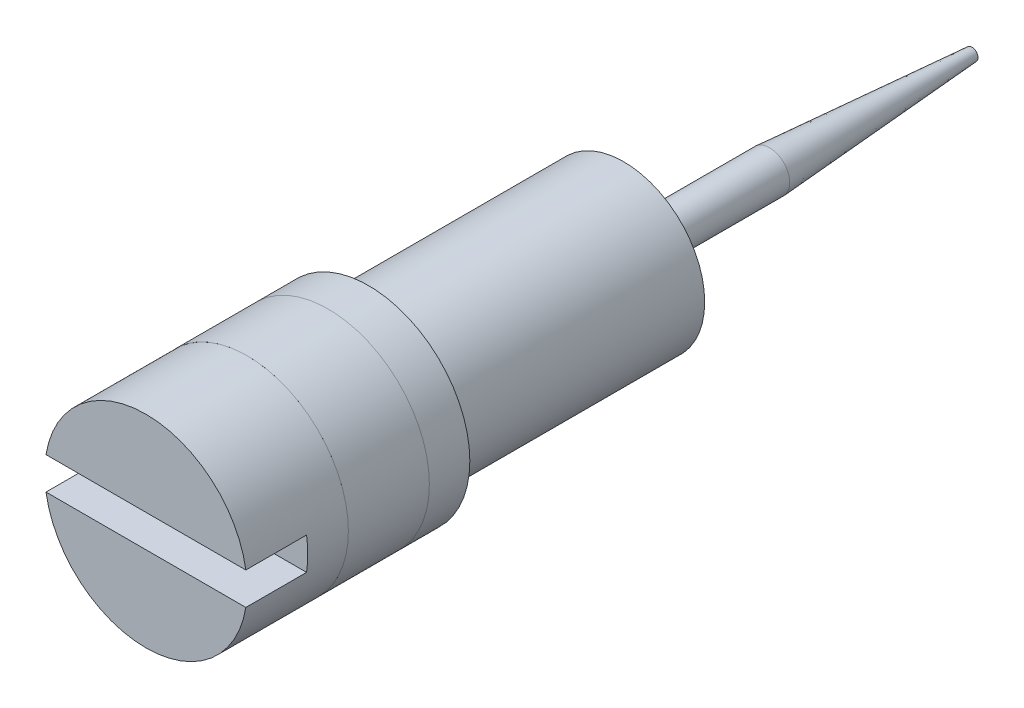
ISO-10303-21;
HEADER;
FILE_DESCRIPTION(('STEP AP214'),'2;1');
FILE_NAME('part.step','',(''),(''),'','','');
FILE_SCHEMA(('AUTOMOTIVE_DESIGN { 1 0 10303 214 1 1 1 1 }'));
ENDSEC;
DATA;
#1=APPLICATION_CONTEXT('core data for automotive mechanical design processes');
#2=APPLICATION_PROTOCOL_DEFINITION('international standard','automotive_design',2000,#1);
#3=PRODUCT_CONTEXT('',#1,'mechanical');
#4=PRODUCT('Part','Part','',(#3));
#5=PRODUCT_RELATED_PRODUCT_CATEGORY('part','',(#4));
#6=PRODUCT_DEFINITION_FORMATION('','',#4);
#7=PRODUCT_DEFINITION_CONTEXT('part definition',#1,'design');
#8=PRODUCT_DEFINITION('design','',#6,#7);
#9=PRODUCT_DEFINITION_SHAPE('','',#8);
#10=(LENGTH_UNIT() NAMED_UNIT(*) SI_UNIT(.MILLI.,.METRE.));
#11=(NAMED_UNIT(*) PLANE_ANGLE_UNIT() SI_UNIT($,.RADIAN.));
#12=(NAMED_UNIT(*) SI_UNIT($,.STERADIAN.) SOLID_ANGLE_UNIT());
#13=UNCERTAINTY_MEASURE_WITH_UNIT(LENGTH_MEASURE(1.E-05),#10,'distance_accuracy_value','');
#14=(GEOMETRIC_REPRESENTATION_CONTEXT(3) GLOBAL_UNCERTAINTY_ASSIGNED_CONTEXT((#13)) GLOBAL_UNIT_ASSIGNED_CONTEXT((#10,
#11,#12)) REPRESENTATION_CONTEXT('',''));
#15=CARTESIAN_POINT('',(0.,0.,0.));
#16=DIRECTION('',(0.,0.,1.));
#17=DIRECTION('',(1.,0.,0.));
#18=AXIS2_PLACEMENT_3D('',#15,#16,#17);
#19=CARTESIAN_POINT('',(0.,0.,4.04363136286653));
#20=DIRECTION('',(0.,0.,0.999999999999998));
#21=DIRECTION('',(0.999999999999998,0.,0.));
#22=AXIS2_PLACEMENT_3D('',#19,#20,#21);
#23=CYLINDRICAL_SURFACE('',#22,1.65);
#24=CARTESIAN_POINT('',(0.,0.,-1.99999999999995));
#25=DIRECTION('',(0.,0.,0.999999999999998));
#26=DIRECTION('',(0.999999999999998,0.,0.));
#27=AXIS2_PLACEMENT_3D('',#24,#25,#26);
#28=CIRCLE('',#27,1.65);
#29=CARTESIAN_POINT('',(1.64999999999999,0.,-1.99999999999995));
#30=VERTEX_POINT('',#29);
#31=EDGE_CURVE('E11',#30,#30,#28,.T.);
#32=CARTESIAN_POINT('',(0.,0.,0.));
#33=DIRECTION('',(0.,0.,0.999999999999998));
#34=DIRECTION('',(0.999999999999998,0.,0.));
#35=AXIS2_PLACEMENT_3D('',#32,#33,#34);
#36=CIRCLE('',#35,1.65);
#37=CARTESIAN_POINT('',(1.64999999999999,0.,0.));
#38=VERTEX_POINT('',#37);
#39=EDGE_CURVE('E60',#38,#38,#36,.T.);
#40=CARTESIAN_POINT('',(1.64999999999999,0.,-1.99999999999995));
#41=CARTESIAN_POINT('',(1.64999999999999,0.,-1.97916666666662));
#42=CARTESIAN_POINT('',(1.64999999999999,0.,-1.95833333333328));
#43=CARTESIAN_POINT('',(1.64999999999999,0.,-1.91666666666662));
#44=CARTESIAN_POINT('',(1.64999999999999,0.,-1.89583333333328));
#45=CARTESIAN_POINT('',(1.64999999999999,0.,-1.85416666666662));
#46=CARTESIAN_POINT('',(1.64999999999999,0.,-1.83333333333329));
#47=CARTESIAN_POINT('',(1.64999999999999,0.,-1.79166666666662));
#48=CARTESIAN_POINT('',(1.64999999999999,0.,-1.77083333333329));
#49=CARTESIAN_POINT('',(1.64999999999999,0.,-1.72916666666662));
#50=CARTESIAN_POINT('',(1.64999999999999,0.,-1.70833333333329));
#51=CARTESIAN_POINT('',(1.64999999999999,0.,-1.66666666666662));
#52=CARTESIAN_POINT('',(1.64999999999999,0.,-1.64583333333329));
#53=CARTESIAN_POINT('',(1.64999999999999,0.,-1.60416666666662));
#54=CARTESIAN_POINT('',(1.64999999999999,0.,-1.58333333333329));
#55=CARTESIAN_POINT('',(1.64999999999999,0.,-1.54166666666663));
#56=CARTESIAN_POINT('',(1.64999999999999,0.,-1.52083333333329));
#57=CARTESIAN_POINT('',(1.64999999999999,0.,-1.47916666666663));
#58=CARTESIAN_POINT('',(1.64999999999999,0.,-1.4583333333333));
#59=CARTESIAN_POINT('',(1.64999999999999,0.,-1.41666666666663));
#60=CARTESIAN_POINT('',(1.64999999999999,0.,-1.3958333333333));
#61=CARTESIAN_POINT('',(1.64999999999999,0.,-1.35416666666663));
#62=CARTESIAN_POINT('',(1.64999999999999,0.,-1.3333333333333));
#63=CARTESIAN_POINT('',(1.64999999999999,0.,-1.29166666666663));
#64=CARTESIAN_POINT('',(1.64999999999999,0.,-1.2708333333333));
#65=CARTESIAN_POINT('',(1.64999999999999,0.,-1.22916666666663));
#66=CARTESIAN_POINT('',(1.64999999999999,0.,-1.2083333333333));
#67=CARTESIAN_POINT('',(1.64999999999999,0.,-1.16666666666664));
#68=CARTESIAN_POINT('',(1.64999999999999,0.,-1.1458333333333));
#69=CARTESIAN_POINT('',(1.64999999999999,0.,-1.10416666666664));
#70=CARTESIAN_POINT('',(1.64999999999999,0.,-1.08333333333331));
#71=CARTESIAN_POINT('',(1.64999999999999,0.,-1.04166666666664));
#72=CARTESIAN_POINT('',(1.64999999999999,0.,-1.02083333333331));
#73=CARTESIAN_POINT('',(1.64999999999999,0.,-0.979166666666642));
#74=CARTESIAN_POINT('',(1.64999999999999,0.,-0.958333333333309));
#75=CARTESIAN_POINT('',(1.64999999999999,0.,-0.916666666666644));
#76=CARTESIAN_POINT('',(1.64999999999999,0.,-0.895833333333311));
#77=CARTESIAN_POINT('',(1.64999999999999,0.,-0.854166666666645));
#78=CARTESIAN_POINT('',(1.64999999999999,0.,-0.833333333333313));
#79=CARTESIAN_POINT('',(1.64999999999999,0.,-0.791666666666647));
#80=CARTESIAN_POINT('',(1.64999999999999,0.,-0.770833333333314));
#81=CARTESIAN_POINT('',(1.64999999999999,0.,-0.729166666666649));
#82=CARTESIAN_POINT('',(1.64999999999999,0.,-0.708333333333316));
#83=CARTESIAN_POINT('',(1.64999999999999,0.,-0.66666666666665));
#84=CARTESIAN_POINT('',(1.64999999999999,0.,-0.645833333333317));
#85=CARTESIAN_POINT('',(1.64999999999999,0.,-0.604166666666652));
#86=CARTESIAN_POINT('',(1.64999999999999,0.,-0.583333333333319));
#87=CARTESIAN_POINT('',(1.64999999999999,0.,-0.541666666666654));
#88=CARTESIAN_POINT('',(1.64999999999999,0.,-0.520833333333321));
#89=CARTESIAN_POINT('',(1.64999999999999,0.,-0.479166666666656));
#90=CARTESIAN_POINT('',(1.64999999999999,0.,-0.458333333333323));
#91=CARTESIAN_POINT('',(1.64999999999999,0.,-0.416666666666657));
#92=CARTESIAN_POINT('',(1.64999999999999,0.,-0.395833333333324));
#93=CARTESIAN_POINT('',(1.64999999999999,0.,-0.354166666666659));
#94=CARTESIAN_POINT('',(1.64999999999999,0.,-0.333333333333326));
#95=CARTESIAN_POINT('',(1.64999999999999,0.,-0.29166666666666));
#96=CARTESIAN_POINT('',(1.64999999999999,0.,-0.270833333333327));
#97=CARTESIAN_POINT('',(1.64999999999999,0.,-0.229166666666661));
#98=CARTESIAN_POINT('',(1.64999999999999,0.,-0.208333333333329));
#99=CARTESIAN_POINT('',(1.64999999999999,0.,-0.166666666666663));
#100=CARTESIAN_POINT('',(1.64999999999999,0.,-0.14583333333333));
#101=CARTESIAN_POINT('',(1.64999999999999,0.,-0.104166666666665));
#102=CARTESIAN_POINT('',(1.64999999999999,0.,-0.0833333333333326));
#103=CARTESIAN_POINT('',(1.64999999999999,0.,-0.0416666666666673));
#104=CARTESIAN_POINT('',(1.64999999999999,0.,-0.0208333333333345));
#105=CARTESIAN_POINT('',(1.64999999999999,0.,0.));
#106=B_SPLINE_CURVE_WITH_KNOTS('',3,(#40,#41,#42,#43,#44,#45,#46,#47,#48,#49,#50,#51,#52,#53,
#54,#55,#56,#57,#58,#59,#60,#61,#62,#63,#64,#65,#66,#67,#68,#69,#70,#71,#72,#73,#74,#75,#76,#77,
#78,#79,#80,#81,#82,#83,#84,#85,#86,#87,#88,#89,#90,#91,#92,#93,#94,#95,#96,#97,#98,#99,#100,
#101,#102,#103,#104,#105),.UNSPECIFIED.,.F.,.F.,(4,2,2,2,2,2,2,2,2,2,2,2,2,2,2,2,2,2,2,2,2,2,2,
2,2,2,2,2,2,2,2,2,4),(0.,0.0624999999999983,0.124999999999997,0.187499999999995,
0.249999999999993,0.312499999999992,0.374999999999991,0.437499999999988,0.499999999999987,
0.562499999999985,0.624999999999983,0.687499999999982,0.749999999999981,0.812499999999979,
0.874999999999977,0.937499999999975,0.999999999999973,1.06249999999997,1.12499999999997,
1.18749999999997,1.24999999999997,1.31249999999996,1.37499999999996,1.43749999999996,
1.49999999999996,1.56249999999996,1.62499999999996,1.68749999999996,1.74999999999995,
1.81249999999995,1.87499999999995,1.93749999999995,1.99999999999995),.UNSPECIFIED.);
#107=EDGE_CURVE('BSEAM46',#30,#38,#106,.T.);
#108=ORIENTED_EDGE('',*,*,#31,.F.);
#109=ORIENTED_EDGE('',*,*,#39,.T.);
#110=ORIENTED_EDGE('',*,*,#107,.T.);
#111=ORIENTED_EDGE('',*,*,#107,.F.);
#112=EDGE_LOOP('',(#108,#110,#109,#111));
#113=FACE_BOUND('',#112,.T.);
#114=ADVANCED_FACE('F46',(#113),#23,.F.);
#115=CARTESIAN_POINT('',(1.65000000000001,0.,-1.99999999999995));
#116=DIRECTION('',(0.,0.,0.999999999999998));
#117=DIRECTION('',(0.999999999999998,0.,0.));
#118=AXIS2_PLACEMENT_3D('',#115,#116,#117);
#119=PLANE('',#118);
#120=CARTESIAN_POINT('',(0.,0.,-1.99999999999995));
#121=DIRECTION('',(0.,0.,0.999999999999998));
#122=DIRECTION('',(0.999999999999998,0.,0.));
#123=AXIS2_PLACEMENT_3D('',#120,#121,#122);
#124=CIRCLE('',#123,2.5);
#125=CARTESIAN_POINT('',(2.49999999999999,0.,-1.99999999999995));
#126=VERTEX_POINT('',#125);
#127=EDGE_CURVE('E52',#126,#126,#124,.T.);
#128=ORIENTED_EDGE('',*,*,#127,.F.);
#129=EDGE_LOOP('',(#128));
#130=FACE_BOUND('',#129,.T.);
#131=ORIENTED_EDGE('',*,*,#31,.T.);
#132=EDGE_LOOP('',(#131));
#133=FACE_BOUND('',#132,.T.);
#134=ADVANCED_FACE('F75',(#130,#133),#119,.F.);
#135=CARTESIAN_POINT('',(0.,0.,4.04363136286653));
#136=DIRECTION('',(0.,0.,0.999999999999998));
#137=DIRECTION('',(0.999999999999998,0.,0.));
#138=AXIS2_PLACEMENT_3D('',#135,#136,#137);
#139=CYLINDRICAL_SURFACE('',#138,2.5);
#140=CARTESIAN_POINT('',(0.,0.,0.));
#141=DIRECTION('',(0.,0.,0.999999999999998));
#142=DIRECTION('',(0.999999999999998,0.,0.));
#143=AXIS2_PLACEMENT_3D('',#140,#141,#142);
#144=CIRCLE('',#143,2.5);
#145=CARTESIAN_POINT('',(2.49999999999999,0.,0.));
#146=VERTEX_POINT('',#145);
#147=EDGE_CURVE('E56',#146,#146,#144,.T.);
#148=CARTESIAN_POINT('',(2.49999999999999,0.,0.));
#149=CARTESIAN_POINT('',(2.49999999999999,0.,-0.0208333333333345));
#150=CARTESIAN_POINT('',(2.49999999999999,0.,-0.0416666666666673));
#151=CARTESIAN_POINT('',(2.49999999999999,0.,-0.0833333333333325));
#152=CARTESIAN_POINT('',(2.49999999999999,0.,-0.104166666666665));
#153=CARTESIAN_POINT('',(2.49999999999999,0.,-0.14583333333333));
#154=CARTESIAN_POINT('',(2.49999999999999,0.,-0.166666666666663));
#155=CARTESIAN_POINT('',(2.49999999999999,0.,-0.208333333333329));
#156=CARTESIAN_POINT('',(2.49999999999999,0.,-0.229166666666661));
#157=CARTESIAN_POINT('',(2.49999999999999,0.,-0.270833333333327));
#158=CARTESIAN_POINT('',(2.49999999999999,0.,-0.29166666666666));
#159=CARTESIAN_POINT('',(2.49999999999999,0.,-0.333333333333326));
#160=CARTESIAN_POINT('',(2.49999999999999,0.,-0.354166666666659));
#161=CARTESIAN_POINT('',(2.49999999999999,0.,-0.395833333333324));
#162=CARTESIAN_POINT('',(2.49999999999999,0.,-0.416666666666657));
#163=CARTESIAN_POINT('',(2.49999999999999,0.,-0.458333333333323));
#164=CARTESIAN_POINT('',(2.49999999999999,0.,-0.479166666666656));
#165=CARTESIAN_POINT('',(2.49999999999999,0.,-0.520833333333321));
#166=CARTESIAN_POINT('',(2.49999999999999,0.,-0.541666666666654));
#167=CARTESIAN_POINT('',(2.49999999999999,0.,-0.583333333333319));
#168=CARTESIAN_POINT('',(2.49999999999999,0.,-0.604166666666652));
#169=CARTESIAN_POINT('',(2.49999999999999,0.,-0.645833333333317));
#170=CARTESIAN_POINT('',(2.49999999999999,0.,-0.66666666666665));
#171=CARTESIAN_POINT('',(2.49999999999999,0.,-0.708333333333315));
#172=CARTESIAN_POINT('',(2.49999999999999,0.,-0.729166666666649));
#173=CARTESIAN_POINT('',(2.49999999999999,0.,-0.770833333333314));
#174=CARTESIAN_POINT('',(2.49999999999999,0.,-0.791666666666647));
#175=CARTESIAN_POINT('',(2.49999999999999,0.,-0.833333333333313));
#176=CARTESIAN_POINT('',(2.49999999999999,0.,-0.854166666666645));
#177=CARTESIAN_POINT('',(2.49999999999999,0.,-0.895833333333311));
#178=CARTESIAN_POINT('',(2.49999999999999,0.,-0.916666666666644));
#179=CARTESIAN_POINT('',(2.49999999999999,0.,-0.958333333333309));
#180=CARTESIAN_POINT('',(2.49999999999999,0.,-0.979166666666642));
#181=CARTESIAN_POINT('',(2.49999999999999,0.,-1.02083333333331));
#182=CARTESIAN_POINT('',(2.49999999999999,0.,-1.04166666666664));
#183=CARTESIAN_POINT('',(2.49999999999999,0.,-1.08333333333331));
#184=CARTESIAN_POINT('',(2.49999999999999,0.,-1.10416666666664));
#185=CARTESIAN_POINT('',(2.49999999999999,0.,-1.1458333333333));
#186=CARTESIAN_POINT('',(2.49999999999999,0.,-1.16666666666664));
#187=CARTESIAN_POINT('',(2.49999999999999,0.,-1.2083333333333));
#188=CARTESIAN_POINT('',(2.49999999999999,0.,-1.22916666666663));
#189=CARTESIAN_POINT('',(2.49999999999999,0.,-1.2708333333333));
#190=CARTESIAN_POINT('',(2.49999999999999,0.,-1.29166666666663));
#191=CARTESIAN_POINT('',(2.49999999999999,0.,-1.3333333333333));
#192=CARTESIAN_POINT('',(2.49999999999999,0.,-1.35416666666663));
#193=CARTESIAN_POINT('',(2.49999999999999,0.,-1.3958333333333));
#194=CARTESIAN_POINT('',(2.49999999999999,0.,-1.41666666666663));
#195=CARTESIAN_POINT('',(2.49999999999999,0.,-1.4583333333333));
#196=CARTESIAN_POINT('',(2.49999999999999,0.,-1.47916666666663));
#197=CARTESIAN_POINT('',(2.49999999999999,0.,-1.52083333333329));
#198=CARTESIAN_POINT('',(2.49999999999999,0.,-1.54166666666663));
#199=CARTESIAN_POINT('',(2.49999999999999,0.,-1.58333333333329));
#200=CARTESIAN_POINT('',(2.49999999999999,0.,-1.60416666666662));
#201=CARTESIAN_POINT('',(2.49999999999999,0.,-1.64583333333329));
#202=CARTESIAN_POINT('',(2.49999999999999,0.,-1.66666666666662));
#203=CARTESIAN_POINT('',(2.49999999999999,0.,-1.70833333333329));
#204=CARTESIAN_POINT('',(2.49999999999999,0.,-1.72916666666662));
#205=CARTESIAN_POINT('',(2.49999999999999,0.,-1.77083333333329));
#206=CARTESIAN_POINT('',(2.49999999999999,0.,-1.79166666666662));
#207=CARTESIAN_POINT('',(2.49999999999999,0.,-1.83333333333329));
#208=CARTESIAN_POINT('',(2.49999999999999,0.,-1.85416666666662));
#209=CARTESIAN_POINT('',(2.49999999999999,0.,-1.89583333333328));
#210=CARTESIAN_POINT('',(2.49999999999999,0.,-1.91666666666662));
#211=CARTESIAN_POINT('',(2.49999999999999,0.,-1.95833333333328));
#212=CARTESIAN_POINT('',(2.49999999999999,0.,-1.97916666666662));
#213=CARTESIAN_POINT('',(2.49999999999999,0.,-1.99999999999995));
#214=B_SPLINE_CURVE_WITH_KNOTS('',3,(#148,#149,#150,#151,#152,#153,#154,#155,#156,#157,#158,
#159,#160,#161,#162,#163,#164,#165,#166,#167,#168,#169,#170,#171,#172,#173,#174,#175,#176,#177,
#178,#179,#180,#181,#182,#183,#184,#185,#186,#187,#188,#189,#190,#191,#192,#193,#194,#195,#196,
#197,#198,#199,#200,#201,#202,#203,#204,#205,#206,#207,#208,#209,#210,#211,#212,#213),
.UNSPECIFIED.,.F.,.F.,(4,2,2,2,2,2,2,2,2,2,2,2,2,2,2,2,2,2,2,2,2,2,2,2,2,2,2,2,2,2,2,2,4),(0.,
0.0624999999999983,0.124999999999996,0.187499999999994,0.249999999999992,0.312499999999992,
0.37499999999999,0.437499999999988,0.499999999999987,0.562499999999985,0.624999999999982,
0.687499999999981,0.74999999999998,0.812499999999978,0.874999999999976,0.937499999999975,
0.999999999999973,1.06249999999997,1.12499999999997,1.18749999999997,1.24999999999997,
1.31249999999996,1.37499999999996,1.43749999999996,1.49999999999996,1.56249999999996,
1.62499999999996,1.68749999999995,1.74999999999995,1.81249999999995,1.87499999999995,
1.93749999999995,1.99999999999995),.UNSPECIFIED.);
#215=EDGE_CURVE('BSEAM70',#146,#126,#214,.T.);
#216=ORIENTED_EDGE('',*,*,#147,.F.);
#217=ORIENTED_EDGE('',*,*,#127,.T.);
#218=ORIENTED_EDGE('',*,*,#215,.T.);
#219=ORIENTED_EDGE('',*,*,#215,.F.);
#220=EDGE_LOOP('',(#216,#218,#217,#219));
#221=FACE_BOUND('',#220,.T.);
#222=ADVANCED_FACE('F70',(#221),#139,.T.);
#223=CARTESIAN_POINT('',(1.65,0.,0.));
#224=DIRECTION('',(0.,0.,-0.999999999999998));
#225=DIRECTION('',(-0.999999999999998,0.,0.));
#226=AXIS2_PLACEMENT_3D('',#223,#224,#225);
#227=PLANE('',#226);
#228=ORIENTED_EDGE('',*,*,#39,.F.);
#229=EDGE_LOOP('',(#228));
#230=FACE_BOUND('',#229,.T.);
#231=ORIENTED_EDGE('',*,*,#147,.T.);
#232=EDGE_LOOP('',(#231));
#233=FACE_BOUND('',#232,.T.);
#234=ADVANCED_FACE('F67',(#230,#233),#227,.F.);
#235=CLOSED_SHELL('',(#114,#134,#222,#234));
#236=MANIFOLD_SOLID_BREP('B2',#235);
#237=CARTESIAN_POINT('',(0.,0.,2.50000000000006));
#238=DIRECTION('',(0.,0.,0.999999999999998));
#239=DIRECTION('',(0.999999999999998,0.,0.));
#240=AXIS2_PLACEMENT_3D('',#237,#238,#239);
#241=PLANE('',#240);
#242=DIRECTION('',(0.999999999999998,0.,0.));
#243=VECTOR('',#242,1.);
#244=CARTESIAN_POINT('',(0.,-0.400000000000025,2.5));
#245=LINE('',#244,#243);
#246=CARTESIAN_POINT('',(-2.46779253585062,-0.400000000000095,2.50000000000006));
#247=VERTEX_POINT('',#246);
#248=CARTESIAN_POINT('',(2.46779253585058,-0.400000000000039,2.49999999999999));
#249=VERTEX_POINT('',#248);
#250=EDGE_CURVE('E157',#247,#249,#245,.T.);
#251=ORIENTED_EDGE('',*,*,#250,.F.);
#252=CARTESIAN_POINT('',(0.,0.,2.50000000000006));
#253=DIRECTION('',(0.,0.,0.999999999999998));
#254=DIRECTION('',(0.999999999999998,0.,0.));
#255=AXIS2_PLACEMENT_3D('',#252,#253,#254);
#256=CIRCLE('',#255,2.5);
#257=EDGE_CURVE('E169',#247,#249,#256,.T.);
#258=ORIENTED_EDGE('',*,*,#257,.T.);
#259=EDGE_LOOP('',(#251,#258));
#260=FACE_BOUND('',#259,.T.);
#261=ADVANCED_FACE('F107',(#260),#241,.T.);
#262=CARTESIAN_POINT('',(0.,0.,2.50000000000006));
#263=DIRECTION('',(0.,0.,-0.999999999999998));
#264=DIRECTION('',(-0.999999999999998,0.,0.));
#265=AXIS2_PLACEMENT_3D('',#262,#263,#264);
#266=CYLINDRICAL_SURFACE('',#265,2.5);
#267=ORIENTED_EDGE('',*,*,#257,.F.);
#268=DIRECTION('',(0.,0.,-0.999999999999998));
#269=VECTOR('',#268,1.);
#270=CARTESIAN_POINT('',(-2.46779253585062,-0.400000000000095,2.50000000000006));
#271=LINE('',#270,#269);
#272=CARTESIAN_POINT('',(-2.46779253585061,-0.400000000000025,1.00000000000006));
#273=VERTEX_POINT('',#272);
#274=EDGE_CURVE('E175',#247,#273,#271,.T.);
#275=ORIENTED_EDGE('',*,*,#274,.T.);
#276=CARTESIAN_POINT('',(0.,0.,1.));
#277=DIRECTION('',(0.,0.,0.999999999999998));
#278=DIRECTION('',(0.999999999999998,0.,0.));
#279=AXIS2_PLACEMENT_3D('',#276,#277,#278);
#280=CIRCLE('',#279,2.5);
#281=CARTESIAN_POINT('',(-2.46779253585061,0.399999999999928,1.00000000000004));
#282=VERTEX_POINT('',#281);
#283=EDGE_CURVE('E165',#282,#273,#280,.T.);
#284=ORIENTED_EDGE('',*,*,#283,.F.);
#285=DIRECTION('',(0.,0.,-0.999999999999998));
#286=VECTOR('',#285,1.);
#287=CARTESIAN_POINT('',(-2.46779253585064,0.399999999999998,2.50000000000001));
#288=LINE('',#287,#286);
#289=CARTESIAN_POINT('',(-2.46779253585064,0.399999999999998,2.50000000000001));
#290=VERTEX_POINT('',#289);
#291=EDGE_CURVE('E152',#282,#290,#288,.F.);
#292=ORIENTED_EDGE('',*,*,#291,.T.);
#293=CARTESIAN_POINT('',(2.46779253585061,0.3999999999999,2.50000000000003));
#294=VERTEX_POINT('',#293);
#295=EDGE_CURVE('E158',#294,#290,#256,.T.);
#296=ORIENTED_EDGE('',*,*,#295,.F.);
#297=DIRECTION('',(0.,0.,-0.999999999999998));
#298=VECTOR('',#297,1.);
#299=CARTESIAN_POINT('',(2.46779253585061,0.3999999999999,2.50000000000003));
#300=LINE('',#299,#298);
#301=CARTESIAN_POINT('',(2.4677925358506,0.399999999999991,1.00000000000001));
#302=VERTEX_POINT('',#301);
#303=EDGE_CURVE('E124',#294,#302,#300,.T.);
#304=ORIENTED_EDGE('',*,*,#303,.T.);
#305=CARTESIAN_POINT('',(2.46779253585057,-0.400000000000053,1.00000000000006));
#306=VERTEX_POINT('',#305);
#307=EDGE_CURVE('E111',#306,#302,#280,.T.);
#308=ORIENTED_EDGE('',*,*,#307,.F.);
#309=DIRECTION('',(0.,0.,-0.999999999999998));
#310=VECTOR('',#309,1.);
#311=CARTESIAN_POINT('',(2.46779253585058,-0.400000000000039,2.49999999999999));
#312=LINE('',#311,#310);
#313=EDGE_CURVE('E132',#306,#249,#312,.F.);
#314=ORIENTED_EDGE('',*,*,#313,.T.);
#315=EDGE_LOOP('',(#267,#275,#284,#292,#296,#304,#308,#314));
#316=FACE_BOUND('',#315,.T.);
#317=CARTESIAN_POINT('',(0.,0.,0.));
#318=DIRECTION('',(0.,0.,0.999999999999998));
#319=DIRECTION('',(0.999999999999998,0.,0.));
#320=AXIS2_PLACEMENT_3D('',#317,#318,#319);
#321=CIRCLE('',#320,2.5);
#322=CARTESIAN_POINT('',(2.5,0.,0.));
#323=VERTEX_POINT('',#322);
#324=EDGE_CURVE('E172',#323,#323,#321,.T.);
#325=ORIENTED_EDGE('',*,*,#324,.T.);
#326=EDGE_LOOP('',(#325));
#327=FACE_BOUND('',#326,.T.);
#328=ADVANCED_FACE('F109',(#316,#327),#266,.T.);
#329=DIRECTION('',(-0.999999999999998,0.,0.));
#330=VECTOR('',#329,1.);
#331=CARTESIAN_POINT('',(0.,0.399999999999984,2.5));
#332=LINE('',#331,#330);
#333=EDGE_CURVE('E149',#294,#290,#332,.T.);
#334=ORIENTED_EDGE('',*,*,#333,.F.);
#335=ORIENTED_EDGE('',*,*,#295,.T.);
#336=EDGE_LOOP('',(#334,#335));
#337=FACE_BOUND('',#336,.T.);
#338=ADVANCED_FACE('F168',(#337),#241,.T.);
#339=CARTESIAN_POINT('',(0.,0.,0.));
#340=DIRECTION('',(0.,0.,0.999999999999998));
#341=DIRECTION('',(0.999999999999998,0.,0.));
#342=AXIS2_PLACEMENT_3D('',#339,#340,#341);
#343=PLANE('',#342);
#344=CARTESIAN_POINT('',(0.,0.,0.));
#345=DIRECTION('',(0.,0.,-0.999999999999998));
#346=DIRECTION('',(-0.999999999999998,0.,0.));
#347=AXIS2_PLACEMENT_3D('',#344,#345,#346);
#348=CIRCLE('',#347,1.65);
#349=CARTESIAN_POINT('',(1.64999999999999,0.,0.));
#350=VERTEX_POINT('',#349);
#351=EDGE_CURVE('E181',#350,#350,#348,.T.);
#352=ORIENTED_EDGE('',*,*,#351,.F.);
#353=EDGE_LOOP('',(#352));
#354=FACE_BOUND('',#353,.T.);
#355=ORIENTED_EDGE('',*,*,#324,.F.);
#356=EDGE_LOOP('',(#355));
#357=FACE_BOUND('',#356,.T.);
#358=ADVANCED_FACE('F204',(#354,#357),#343,.F.);
#359=CARTESIAN_POINT('',(0.,0.,1.));
#360=DIRECTION('',(0.,0.,0.999999999999998));
#361=DIRECTION('',(0.999999999999998,0.,0.));
#362=AXIS2_PLACEMENT_3D('',#359,#360,#361);
#363=PLANE('',#362);
#364=ORIENTED_EDGE('',*,*,#283,.T.);
#365=DIRECTION('',(0.999999999999998,0.,0.));
#366=VECTOR('',#365,1.);
#367=CARTESIAN_POINT('',(-5.70059010014705,-0.399999999999998,1.00000000000003));
#368=LINE('',#367,#366);
#369=EDGE_CURVE('E166',#273,#306,#368,.T.);
#370=ORIENTED_EDGE('',*,*,#369,.T.);
#371=ORIENTED_EDGE('',*,*,#307,.T.);
#372=DIRECTION('',(-0.999999999999998,0.,0.));
#373=VECTOR('',#372,1.);
#374=CARTESIAN_POINT('',(-5.70059010014705,0.399999999999928,1.00000000000006));
#375=LINE('',#374,#373);
#376=EDGE_CURVE('E192',#302,#282,#375,.T.);
#377=ORIENTED_EDGE('',*,*,#376,.T.);
#378=EDGE_LOOP('',(#364,#370,#371,#377));
#379=FACE_BOUND('',#378,.T.);
#380=ADVANCED_FACE('F208',(#379),#363,.T.);
#381=CARTESIAN_POINT('',(-5.70059010014705,-0.399999999999998,1.00000000000003));
#382=DIRECTION('',(0.,-0.999999999999999,0.));
#383=DIRECTION('',(0.,0.,-0.999999999999998));
#384=AXIS2_PLACEMENT_3D('',#381,#382,#383);
#385=PLANE('',#384);
#386=ORIENTED_EDGE('',*,*,#250,.T.);
#387=ORIENTED_EDGE('',*,*,#313,.F.);
#388=ORIENTED_EDGE('',*,*,#369,.F.);
#389=ORIENTED_EDGE('',*,*,#274,.F.);
#390=EDGE_LOOP('',(#386,#387,#388,#389));
#391=FACE_BOUND('',#390,.T.);
#392=ADVANCED_FACE('F195',(#391),#385,.F.);
#393=CARTESIAN_POINT('',(-5.70059010014705,0.399999999999928,1.00000000000006));
#394=DIRECTION('',(0.,0.999999999999999,0.));
#395=DIRECTION('',(0.,0.,0.999999999999998));
#396=AXIS2_PLACEMENT_3D('',#393,#394,#395);
#397=PLANE('',#396);
#398=ORIENTED_EDGE('',*,*,#333,.T.);
#399=ORIENTED_EDGE('',*,*,#291,.F.);
#400=ORIENTED_EDGE('',*,*,#376,.F.);
#401=ORIENTED_EDGE('',*,*,#303,.F.);
#402=EDGE_LOOP('',(#398,#399,#400,#401));
#403=FACE_BOUND('',#402,.T.);
#404=ADVANCED_FACE('F151',(#403),#397,.F.);
#405=CARTESIAN_POINT('',(0.,0.,-1.99999999999995));
#406=DIRECTION('',(0.,0.,0.999999999999998));
#407=DIRECTION('',(0.999999999999998,0.,0.));
#408=AXIS2_PLACEMENT_3D('',#405,#406,#407);
#409=CYLINDRICAL_SURFACE('',#408,1.65);
#410=CARTESIAN_POINT('',(0.,0.,-1.99999999999995));
#411=DIRECTION('',(0.,0.,-0.999999999999998));
#412=DIRECTION('',(-0.999999999999998,0.,0.));
#413=AXIS2_PLACEMENT_3D('',#410,#411,#412);
#414=CIRCLE('',#413,1.65);
#415=CARTESIAN_POINT('',(1.64999999999999,0.,-1.99999999999995));
#416=VERTEX_POINT('',#415);
#417=EDGE_CURVE('E190',#416,#416,#414,.T.);
#418=CARTESIAN_POINT('',(1.64999999999999,0.,-1.99999999999995));
#419=CARTESIAN_POINT('',(1.64999999999999,0.,-1.97916666666661));
#420=CARTESIAN_POINT('',(1.64999999999999,0.,-1.95833333333328));
#421=CARTESIAN_POINT('',(1.64999999999999,0.,-1.91666666666662));
#422=CARTESIAN_POINT('',(1.64999999999999,0.,-1.89583333333328));
#423=CARTESIAN_POINT('',(1.64999999999999,0.,-1.85416666666662));
#424=CARTESIAN_POINT('',(1.64999999999999,0.,-1.83333333333329));
#425=CARTESIAN_POINT('',(1.64999999999999,0.,-1.79166666666662));
#426=CARTESIAN_POINT('',(1.64999999999999,0.,-1.77083333333329));
#427=CARTESIAN_POINT('',(1.64999999999999,0.,-1.72916666666662));
#428=CARTESIAN_POINT('',(1.64999999999999,0.,-1.70833333333329));
#429=CARTESIAN_POINT('',(1.64999999999999,0.,-1.66666666666662));
#430=CARTESIAN_POINT('',(1.64999999999999,0.,-1.64583333333329));
#431=CARTESIAN_POINT('',(1.64999999999999,0.,-1.60416666666662));
#432=CARTESIAN_POINT('',(1.64999999999999,0.,-1.58333333333329));
#433=CARTESIAN_POINT('',(1.64999999999999,0.,-1.54166666666663));
#434=CARTESIAN_POINT('',(1.64999999999999,0.,-1.52083333333329));
#435=CARTESIAN_POINT('',(1.64999999999999,0.,-1.47916666666663));
#436=CARTESIAN_POINT('',(1.64999999999999,0.,-1.4583333333333));
#437=CARTESIAN_POINT('',(1.64999999999999,0.,-1.41666666666663));
#438=CARTESIAN_POINT('',(1.64999999999999,0.,-1.3958333333333));
#439=CARTESIAN_POINT('',(1.64999999999999,0.,-1.35416666666663));
#440=CARTESIAN_POINT('',(1.64999999999999,0.,-1.3333333333333));
#441=CARTESIAN_POINT('',(1.64999999999999,0.,-1.29166666666663));
#442=CARTESIAN_POINT('',(1.64999999999999,0.,-1.2708333333333));
#443=CARTESIAN_POINT('',(1.64999999999999,0.,-1.22916666666663));
#444=CARTESIAN_POINT('',(1.64999999999999,0.,-1.2083333333333));
#445=CARTESIAN_POINT('',(1.64999999999999,0.,-1.16666666666664));
#446=CARTESIAN_POINT('',(1.64999999999999,0.,-1.1458333333333));
#447=CARTESIAN_POINT('',(1.64999999999999,0.,-1.10416666666664));
#448=CARTESIAN_POINT('',(1.64999999999999,0.,-1.08333333333331));
#449=CARTESIAN_POINT('',(1.64999999999999,0.,-1.04166666666664));
#450=CARTESIAN_POINT('',(1.64999999999999,0.,-1.02083333333331));
#451=CARTESIAN_POINT('',(1.64999999999999,0.,-0.979166666666641));
#452=CARTESIAN_POINT('',(1.64999999999999,0.,-0.958333333333309));
#453=CARTESIAN_POINT('',(1.64999999999999,0.,-0.916666666666643));
#454=CARTESIAN_POINT('',(1.64999999999999,0.,-0.89583333333331));
#455=CARTESIAN_POINT('',(1.64999999999999,0.,-0.854166666666645));
#456=CARTESIAN_POINT('',(1.64999999999999,0.,-0.833333333333312));
#457=CARTESIAN_POINT('',(1.64999999999999,0.,-0.791666666666647));
#458=CARTESIAN_POINT('',(1.64999999999999,0.,-0.770833333333314));
#459=CARTESIAN_POINT('',(1.64999999999999,0.,-0.729166666666648));
#460=CARTESIAN_POINT('',(1.64999999999999,0.,-0.708333333333315));
#461=CARTESIAN_POINT('',(1.64999999999999,0.,-0.66666666666665));
#462=CARTESIAN_POINT('',(1.64999999999999,0.,-0.645833333333317));
#463=CARTESIAN_POINT('',(1.64999999999999,0.,-0.604166666666652));
#464=CARTESIAN_POINT('',(1.64999999999999,0.,-0.583333333333319));
#465=CARTESIAN_POINT('',(1.64999999999999,0.,-0.541666666666653));
#466=CARTESIAN_POINT('',(1.64999999999999,0.,-0.52083333333332));
#467=CARTESIAN_POINT('',(1.64999999999999,0.,-0.479166666666655));
#468=CARTESIAN_POINT('',(1.64999999999999,0.,-0.458333333333322));
#469=CARTESIAN_POINT('',(1.64999999999999,0.,-0.416666666666657));
#470=CARTESIAN_POINT('',(1.64999999999999,0.,-0.395833333333324));
#471=CARTESIAN_POINT('',(1.64999999999999,0.,-0.354166666666658));
#472=CARTESIAN_POINT('',(1.64999999999999,0.,-0.333333333333325));
#473=CARTESIAN_POINT('',(1.64999999999999,0.,-0.29166666666666));
#474=CARTESIAN_POINT('',(1.64999999999999,0.,-0.270833333333327));
#475=CARTESIAN_POINT('',(1.64999999999999,0.,-0.229166666666662));
#476=CARTESIAN_POINT('',(1.64999999999999,0.,-0.208333333333329));
#477=CARTESIAN_POINT('',(1.64999999999999,0.,-0.166666666666663));
#478=CARTESIAN_POINT('',(1.64999999999999,0.,-0.145833333333331));
#479=CARTESIAN_POINT('',(1.64999999999999,0.,-0.104166666666665));
#480=CARTESIAN_POINT('',(1.64999999999999,0.,-0.0833333333333322));
#481=CARTESIAN_POINT('',(1.64999999999999,0.,-0.0416666666666667));
#482=CARTESIAN_POINT('',(1.64999999999999,0.,-0.020833333333334));
#483=CARTESIAN_POINT('',(1.64999999999999,0.,0.));
#484=B_SPLINE_CURVE_WITH_KNOTS('',3,(#418,#419,#420,#421,#422,#423,#424,#425,#426,#427,#428,
#429,#430,#431,#432,#433,#434,#435,#436,#437,#438,#439,#440,#441,#442,#443,#444,#445,#446,#447,
#448,#449,#450,#451,#452,#453,#454,#455,#456,#457,#458,#459,#460,#461,#462,#463,#464,#465,#466,
#467,#468,#469,#470,#471,#472,#473,#474,#475,#476,#477,#478,#479,#480,#481,#482,#483),
.UNSPECIFIED.,.F.,.F.,(4,2,2,2,2,2,2,2,2,2,2,2,2,2,2,2,2,2,2,2,2,2,2,2,2,2,2,2,2,2,2,2,4),(0.,
0.0624999999999985,0.124999999999997,0.187499999999995,0.249999999999994,0.312499999999992,
0.37499999999999,0.437499999999988,0.499999999999987,0.562499999999985,0.624999999999983,
0.687499999999982,0.74999999999998,0.812499999999978,0.874999999999977,0.937499999999975,
0.999999999999973,1.06249999999997,1.12499999999997,1.18749999999997,1.24999999999997,
1.31249999999996,1.37499999999996,1.43749999999996,1.49999999999996,1.56249999999996,
1.62499999999996,1.68749999999995,1.74999999999995,1.81249999999995,1.87499999999995,
1.93749999999995,1.99999999999995),.UNSPECIFIED.);
#485=EDGE_CURVE('BSEAM221',#416,#350,#484,.T.);
#486=ORIENTED_EDGE('',*,*,#417,.F.);
#487=ORIENTED_EDGE('',*,*,#351,.T.);
#488=ORIENTED_EDGE('',*,*,#485,.T.);
#489=ORIENTED_EDGE('',*,*,#485,.F.);
#490=EDGE_LOOP('',(#486,#488,#487,#489));
#491=FACE_BOUND('',#490,.T.);
#492=ADVANCED_FACE('F221',(#491),#409,.T.);
#493=CARTESIAN_POINT('',(0.,0.,-2.99999999999995));
#494=DIRECTION('',(0.,0.,0.999999999999998));
#495=DIRECTION('',(0.999999999999998,0.,0.));
#496=AXIS2_PLACEMENT_3D('',#493,#494,#495);
#497=CYLINDRICAL_SURFACE('',#496,2.5);
#498=CARTESIAN_POINT('',(0.,0.,-2.99999999999995));
#499=DIRECTION('',(0.,0.,-0.999999999999998));
#500=DIRECTION('',(-0.999999999999998,0.,0.));
#501=AXIS2_PLACEMENT_3D('',#498,#499,#500);
#502=CIRCLE('',#501,2.5);
#503=CARTESIAN_POINT('',(2.49999999999998,0.,-2.99999999999995));
#504=VERTEX_POINT('',#503);
#505=EDGE_CURVE('E237',#504,#504,#502,.T.);
#506=CARTESIAN_POINT('',(0.,0.,-1.99999999999995));
#507=DIRECTION('',(0.,0.,-0.999999999999998));
#508=DIRECTION('',(-0.999999999999998,0.,0.));
#509=AXIS2_PLACEMENT_3D('',#506,#507,#508);
#510=CIRCLE('',#509,2.5);
#511=CARTESIAN_POINT('',(2.49999999999998,0.,-1.99999999999995));
#512=VERTEX_POINT('',#511);
#513=EDGE_CURVE('E239',#512,#512,#510,.T.);
#514=CARTESIAN_POINT('',(2.49999999999998,0.,-2.99999999999995));
#515=CARTESIAN_POINT('',(2.49999999999998,0.,-2.98958333333328));
#516=CARTESIAN_POINT('',(2.49999999999998,0.,-2.97916666666662));
#517=CARTESIAN_POINT('',(2.49999999999998,0.,-2.95833333333328));
#518=CARTESIAN_POINT('',(2.49999999999998,0.,-2.94791666666662));
#519=CARTESIAN_POINT('',(2.49999999999998,0.,-2.92708333333328));
#520=CARTESIAN_POINT('',(2.49999999999998,0.,-2.91666666666662));
#521=CARTESIAN_POINT('',(2.49999999999998,0.,-2.89583333333328));
#522=CARTESIAN_POINT('',(2.49999999999998,0.,-2.88541666666662));
#523=CARTESIAN_POINT('',(2.49999999999998,0.,-2.86458333333328));
#524=CARTESIAN_POINT('',(2.49999999999998,0.,-2.85416666666662));
#525=CARTESIAN_POINT('',(2.49999999999998,0.,-2.83333333333328));
#526=CARTESIAN_POINT('',(2.49999999999998,0.,-2.82291666666662));
#527=CARTESIAN_POINT('',(2.49999999999998,0.,-2.80208333333328));
#528=CARTESIAN_POINT('',(2.49999999999998,0.,-2.79166666666662));
#529=CARTESIAN_POINT('',(2.49999999999998,0.,-2.77083333333328));
#530=CARTESIAN_POINT('',(2.49999999999998,0.,-2.76041666666662));
#531=CARTESIAN_POINT('',(2.49999999999998,0.,-2.73958333333328));
#532=CARTESIAN_POINT('',(2.49999999999998,0.,-2.72916666666662));
#533=CARTESIAN_POINT('',(2.49999999999998,0.,-2.70833333333328));
#534=CARTESIAN_POINT('',(2.49999999999998,0.,-2.69791666666662));
#535=CARTESIAN_POINT('',(2.49999999999998,0.,-2.67708333333328));
#536=CARTESIAN_POINT('',(2.49999999999998,0.,-2.66666666666662));
#537=CARTESIAN_POINT('',(2.49999999999998,0.,-2.64583333333328));
#538=CARTESIAN_POINT('',(2.49999999999998,0.,-2.63541666666662));
#539=CARTESIAN_POINT('',(2.49999999999998,0.,-2.61458333333328));
#540=CARTESIAN_POINT('',(2.49999999999998,0.,-2.60416666666662));
#541=CARTESIAN_POINT('',(2.49999999999998,0.,-2.58333333333328));
#542=CARTESIAN_POINT('',(2.49999999999998,0.,-2.57291666666662));
#543=CARTESIAN_POINT('',(2.49999999999998,0.,-2.55208333333328));
#544=CARTESIAN_POINT('',(2.49999999999998,0.,-2.54166666666662));
#545=CARTESIAN_POINT('',(2.49999999999998,0.,-2.52083333333328));
#546=CARTESIAN_POINT('',(2.49999999999998,0.,-2.51041666666662));
#547=CARTESIAN_POINT('',(2.49999999999998,0.,-2.48958333333328));
#548=CARTESIAN_POINT('',(2.49999999999998,0.,-2.47916666666662));
#549=CARTESIAN_POINT('',(2.49999999999998,0.,-2.45833333333328));
#550=CARTESIAN_POINT('',(2.49999999999998,0.,-2.44791666666662));
#551=CARTESIAN_POINT('',(2.49999999999998,0.,-2.42708333333328));
#552=CARTESIAN_POINT('',(2.49999999999998,0.,-2.41666666666662));
#553=CARTESIAN_POINT('',(2.49999999999998,0.,-2.39583333333328));
#554=CARTESIAN_POINT('',(2.49999999999998,0.,-2.38541666666662));
#555=CARTESIAN_POINT('',(2.49999999999998,0.,-2.36458333333328));
#556=CARTESIAN_POINT('',(2.49999999999998,0.,-2.35416666666662));
#557=CARTESIAN_POINT('',(2.49999999999998,0.,-2.33333333333328));
#558=CARTESIAN_POINT('',(2.49999999999998,0.,-2.32291666666662));
#559=CARTESIAN_POINT('',(2.49999999999998,0.,-2.30208333333328));
#560=CARTESIAN_POINT('',(2.49999999999998,0.,-2.29166666666662));
#561=CARTESIAN_POINT('',(2.49999999999998,0.,-2.27083333333328));
#562=CARTESIAN_POINT('',(2.49999999999998,0.,-2.26041666666662));
#563=CARTESIAN_POINT('',(2.49999999999998,0.,-2.23958333333328));
#564=CARTESIAN_POINT('',(2.49999999999998,0.,-2.22916666666662));
#565=CARTESIAN_POINT('',(2.49999999999998,0.,-2.20833333333328));
#566=CARTESIAN_POINT('',(2.49999999999998,0.,-2.19791666666662));
#567=CARTESIAN_POINT('',(2.49999999999998,0.,-2.17708333333328));
#568=CARTESIAN_POINT('',(2.49999999999998,0.,-2.16666666666662));
#569=CARTESIAN_POINT('',(2.49999999999998,0.,-2.14583333333328));
#570=CARTESIAN_POINT('',(2.49999999999998,0.,-2.13541666666662));
#571=CARTESIAN_POINT('',(2.49999999999998,0.,-2.11458333333328));
#572=CARTESIAN_POINT('',(2.49999999999998,0.,-2.10416666666662));
#573=CARTESIAN_POINT('',(2.49999999999998,0.,-2.08333333333328));
#574=CARTESIAN_POINT('',(2.49999999999998,0.,-2.07291666666662));
#575=CARTESIAN_POINT('',(2.49999999999998,0.,-2.05208333333328));
#576=CARTESIAN_POINT('',(2.49999999999998,0.,-2.04166666666662));
#577=CARTESIAN_POINT('',(2.49999999999998,0.,-2.02083333333328));
#578=CARTESIAN_POINT('',(2.49999999999998,0.,-2.01041666666662));
#579=CARTESIAN_POINT('',(2.49999999999998,0.,-1.99999999999995));
#580=B_SPLINE_CURVE_WITH_KNOTS('',3,(#514,#515,#516,#517,#518,#519,#520,#521,#522,#523,#524,
#525,#526,#527,#528,#529,#530,#531,#532,#533,#534,#535,#536,#537,#538,#539,#540,#541,#542,#543,
#544,#545,#546,#547,#548,#549,#550,#551,#552,#553,#554,#555,#556,#557,#558,#559,#560,#561,#562,
#563,#564,#565,#566,#567,#568,#569,#570,#571,#572,#573,#574,#575,#576,#577,#578,#579),
.UNSPECIFIED.,.F.,.F.,(4,2,2,2,2,2,2,2,2,2,2,2,2,2,2,2,2,2,2,2,2,2,2,2,2,2,2,2,2,2,2,2,4),(0.,
0.03125,0.0625000000000001,0.0937500000000001,0.125,0.15625,0.1875,0.21875,0.25,0.28125,0.3125,
0.34375,0.375,0.40625,0.4375,0.46875,0.5,0.53125,0.5625,0.593750000000001,0.625000000000001,
0.656250000000001,0.687500000000001,0.718750000000001,0.750000000000001,0.781250000000001,
0.812500000000001,0.843750000000001,0.875000000000001,0.906250000000001,0.937500000000001,
0.968750000000001,1.),.UNSPECIFIED.);
#581=EDGE_CURVE('BSEAM227',#504,#512,#580,.T.);
#582=ORIENTED_EDGE('',*,*,#505,.F.);
#583=ORIENTED_EDGE('',*,*,#513,.T.);
#584=ORIENTED_EDGE('',*,*,#581,.T.);
#585=ORIENTED_EDGE('',*,*,#581,.F.);
#586=EDGE_LOOP('',(#582,#584,#583,#585));
#587=FACE_BOUND('',#586,.T.);
#588=ADVANCED_FACE('F227',(#587),#497,.T.);
#589=CARTESIAN_POINT('',(0.,0.,-2.99999999999995));
#590=DIRECTION('',(0.,0.,-0.999999999999998));
#591=DIRECTION('',(-0.999999999999998,0.,0.));
#592=AXIS2_PLACEMENT_3D('',#589,#590,#591);
#593=PLANE('',#592);
#594=CARTESIAN_POINT('',(0.,0.,-2.99999999999995));
#595=DIRECTION('',(0.,0.,-0.999999999999998));
#596=DIRECTION('',(-0.999999999999998,0.,0.));
#597=AXIS2_PLACEMENT_3D('',#594,#595,#596);
#598=CIRCLE('',#597,2.);
#599=CARTESIAN_POINT('',(2.00000000000001,0.,-2.99999999999995));
#600=VERTEX_POINT('',#599);
#601=EDGE_CURVE('E116',#600,#600,#598,.T.);
#602=ORIENTED_EDGE('',*,*,#601,.F.);
#603=EDGE_LOOP('',(#602));
#604=FACE_BOUND('',#603,.T.);
#605=ORIENTED_EDGE('',*,*,#505,.T.);
#606=EDGE_LOOP('',(#605));
#607=FACE_BOUND('',#606,.T.);
#608=ADVANCED_FACE('F232',(#604,#607),#593,.T.);
#609=CARTESIAN_POINT('',(0.,0.,-1.99999999999995));
#610=DIRECTION('',(0.,0.,-0.999999999999998));
#611=DIRECTION('',(-0.999999999999998,0.,0.));
#612=AXIS2_PLACEMENT_3D('',#609,#610,#611);
#613=PLANE('',#612);
#614=ORIENTED_EDGE('',*,*,#417,.T.);
#615=EDGE_LOOP('',(#614));
#616=FACE_BOUND('',#615,.T.);
#617=ORIENTED_EDGE('',*,*,#513,.F.);
#618=EDGE_LOOP('',(#617));
#619=FACE_BOUND('',#618,.T.);
#620=ADVANCED_FACE('F278',(#616,#619),#613,.F.);
#621=CARTESIAN_POINT('',(0.,0.,-9.29999999999993));
#622=DIRECTION('',(0.,0.,0.999999999999998));
#623=DIRECTION('',(0.999999999999998,0.,0.));
#624=AXIS2_PLACEMENT_3D('',#621,#622,#623);
#625=CYLINDRICAL_SURFACE('',#624,2.);
#626=CARTESIAN_POINT('',(0.,0.,-9.29999999999993));
#627=DIRECTION('',(0.,0.,-0.999999999999998));
#628=DIRECTION('',(-0.999999999999998,0.,0.));
#629=AXIS2_PLACEMENT_3D('',#626,#627,#628);
#630=CIRCLE('',#629,2.);
#631=CARTESIAN_POINT('',(2.,0.,-9.29999999999993));
#632=VERTEX_POINT('',#631);
#633=EDGE_CURVE('E244',#632,#632,#630,.T.);
#634=CARTESIAN_POINT('',(2.,0.,-9.29999999999993));
#635=CARTESIAN_POINT('',(2.,0.,-9.23437499999994));
#636=CARTESIAN_POINT('',(2.,0.,-9.16874999999993));
#637=CARTESIAN_POINT('',(2.,0.,-9.03749999999993));
#638=CARTESIAN_POINT('',(2.,0.,-8.97187499999993));
#639=CARTESIAN_POINT('',(2.,0.,-8.84062499999994));
#640=CARTESIAN_POINT('',(2.,0.,-8.77499999999994));
#641=CARTESIAN_POINT('',(2.,0.,-8.64374999999994));
#642=CARTESIAN_POINT('',(2.,0.,-8.57812499999994));
#643=CARTESIAN_POINT('',(2.,0.,-8.44687499999994));
#644=CARTESIAN_POINT('',(2.,0.,-8.38124999999994));
#645=CARTESIAN_POINT('',(2.,0.,-8.24999999999994));
#646=CARTESIAN_POINT('',(2.,0.,-8.18437499999994));
#647=CARTESIAN_POINT('',(2.,0.,-8.05312499999994));
#648=CARTESIAN_POINT('',(2.,0.,-7.98749999999994));
#649=CARTESIAN_POINT('',(2.,0.,-7.85624999999994));
#650=CARTESIAN_POINT('',(2.,0.,-7.79062499999994));
#651=CARTESIAN_POINT('',(2.,0.,-7.65937499999994));
#652=CARTESIAN_POINT('',(2.,0.,-7.59374999999994));
#653=CARTESIAN_POINT('',(2.,0.,-7.46249999999994));
#654=CARTESIAN_POINT('',(2.,0.,-7.39687499999994));
#655=CARTESIAN_POINT('',(2.,0.,-7.26562499999994));
#656=CARTESIAN_POINT('',(2.,0.,-7.19999999999994));
#657=CARTESIAN_POINT('',(2.,0.,-7.06874999999994));
#658=CARTESIAN_POINT('',(2.,0.,-7.00312499999994));
#659=CARTESIAN_POINT('',(2.,0.,-6.87187499999994));
#660=CARTESIAN_POINT('',(2.,0.,-6.80624999999994));
#661=CARTESIAN_POINT('',(2.,0.,-6.67499999999994));
#662=CARTESIAN_POINT('',(2.,0.,-6.60937499999994));
#663=CARTESIAN_POINT('',(2.,0.,-6.47812499999994));
#664=CARTESIAN_POINT('',(2.,0.,-6.41249999999994));
#665=CARTESIAN_POINT('',(2.,0.,-6.28124999999994));
#666=CARTESIAN_POINT('',(2.,0.,-6.21562499999994));
#667=CARTESIAN_POINT('',(2.,0.,-6.08437499999994));
#668=CARTESIAN_POINT('',(2.,0.,-6.01874999999994));
#669=CARTESIAN_POINT('',(2.,0.,-5.88749999999994));
#670=CARTESIAN_POINT('',(2.,0.,-5.82187499999994));
#671=CARTESIAN_POINT('',(2.,0.,-5.69062499999994));
#672=CARTESIAN_POINT('',(2.,0.,-5.62499999999994));
#673=CARTESIAN_POINT('',(2.,0.,-5.49374999999994));
#674=CARTESIAN_POINT('',(2.,0.,-5.42812499999994));
#675=CARTESIAN_POINT('',(2.,0.,-5.29687499999994));
#676=CARTESIAN_POINT('',(2.,0.,-5.23124999999994));
#677=CARTESIAN_POINT('',(2.,0.,-5.09999999999994));
#678=CARTESIAN_POINT('',(2.,0.,-5.03437499999994));
#679=CARTESIAN_POINT('',(2.,0.,-4.90312499999994));
#680=CARTESIAN_POINT('',(2.,0.,-4.83749999999994));
#681=CARTESIAN_POINT('',(2.,0.,-4.70624999999994));
#682=CARTESIAN_POINT('',(2.,0.,-4.64062499999994));
#683=CARTESIAN_POINT('',(2.,0.,-4.50937499999995));
#684=CARTESIAN_POINT('',(2.,0.,-4.44374999999994));
#685=CARTESIAN_POINT('',(2.,0.,-4.31249999999994));
#686=CARTESIAN_POINT('',(2.,0.,-4.24687499999994));
#687=CARTESIAN_POINT('',(2.,0.,-4.11562499999994));
#688=CARTESIAN_POINT('',(2.,0.,-4.04999999999995));
#689=CARTESIAN_POINT('',(2.,0.,-3.91874999999995));
#690=CARTESIAN_POINT('',(2.,0.,-3.85312499999995));
#691=CARTESIAN_POINT('',(2.,0.,-3.72187499999995));
#692=CARTESIAN_POINT('',(2.,0.,-3.65624999999995));
#693=CARTESIAN_POINT('',(2.,0.,-3.52499999999995));
#694=CARTESIAN_POINT('',(2.,0.,-3.45937499999995));
#695=CARTESIAN_POINT('',(2.,0.,-3.32812499999995));
#696=CARTESIAN_POINT('',(2.,0.,-3.26249999999995));
#697=CARTESIAN_POINT('',(2.,0.,-3.13124999999995));
#698=CARTESIAN_POINT('',(2.,0.,-3.06562499999995));
#699=CARTESIAN_POINT('',(2.00000000000001,0.,-2.99999999999995));
#700=B_SPLINE_CURVE_WITH_KNOTS('',3,(#634,#635,#636,#637,#638,#639,#640,#641,#642,#643,#644,
#645,#646,#647,#648,#649,#650,#651,#652,#653,#654,#655,#656,#657,#658,#659,#660,#661,#662,#663,
#664,#665,#666,#667,#668,#669,#670,#671,#672,#673,#674,#675,#676,#677,#678,#679,#680,#681,#682,
#683,#684,#685,#686,#687,#688,#689,#690,#691,#692,#693,#694,#695,#696,#697,#698,#699),
.UNSPECIFIED.,.F.,.F.,(4,2,2,2,2,2,2,2,2,2,2,2,2,2,2,2,2,2,2,2,2,2,2,2,2,2,2,2,2,2,2,2,4),(0.,
0.196875000000001,0.39375,0.590624999999999,0.787499999999998,0.984374999999999,1.18125,
1.378125,1.575,1.771875,1.96875,2.165625,2.3625,2.559375,2.75624999999999,2.95312499999999,
3.14999999999999,3.34687499999999,3.54374999999999,3.74062499999999,3.93749999999999,
4.13437499999999,4.33124999999999,4.52812499999999,4.72499999999999,4.92187499999999,
5.11874999999999,5.31562499999999,5.51249999999999,5.70937499999999,5.90624999999999,
6.10312499999999,6.29999999999999),.UNSPECIFIED.);
#701=EDGE_CURVE('BSEAM272',#632,#600,#700,.T.);
#702=ORIENTED_EDGE('',*,*,#633,.F.);
#703=ORIENTED_EDGE('',*,*,#601,.T.);
#704=ORIENTED_EDGE('',*,*,#701,.T.);
#705=ORIENTED_EDGE('',*,*,#701,.F.);
#706=EDGE_LOOP('',(#702,#704,#703,#705));
#707=FACE_BOUND('',#706,.T.);
#708=ADVANCED_FACE('F272',(#707),#625,.T.);
#709=CARTESIAN_POINT('',(0.,0.,-9.29999999999993));
#710=DIRECTION('',(0.,0.,-0.999999999999998));
#711=DIRECTION('',(-0.999999999999998,0.,0.));
#712=AXIS2_PLACEMENT_3D('',#709,#710,#711);
#713=PLANE('',#712);
#714=CARTESIAN_POINT('',(0.,0.,-9.29999999999993));
#715=DIRECTION('',(0.,0.,-0.999999999999998));
#716=DIRECTION('',(-0.999999999999998,0.,0.));
#717=AXIS2_PLACEMENT_3D('',#714,#715,#716);
#718=CIRCLE('',#717,0.5);
#719=CARTESIAN_POINT('',(0.500000000000026,0.,-9.29999999999993));
#720=VERTEX_POINT('',#719);
#721=EDGE_CURVE('E44',#720,#720,#718,.T.);
#722=ORIENTED_EDGE('',*,*,#721,.F.);
#723=EDGE_LOOP('',(#722));
#724=FACE_BOUND('',#723,.T.);
#725=ORIENTED_EDGE('',*,*,#633,.T.);
#726=EDGE_LOOP('',(#725));
#727=FACE_BOUND('',#726,.T.);
#728=ADVANCED_FACE('F266',(#724,#727),#713,.T.);
#729=CARTESIAN_POINT('',(0.,0.,-12.8999999999999));
#730=DIRECTION('',(0.,0.,0.999999999999998));
#731=DIRECTION('',(0.999999999999998,0.,0.));
#732=AXIS2_PLACEMENT_3D('',#729,#730,#731);
#733=CYLINDRICAL_SURFACE('',#732,0.5);
#734=CARTESIAN_POINT('',(0.,0.,-12.8999999999999));
#735=DIRECTION('',(0.,0.,-0.999999999999998));
#736=DIRECTION('',(-0.999999999999998,0.,0.));
#737=AXIS2_PLACEMENT_3D('',#734,#735,#736);
#738=CIRCLE('',#737,0.5);
#739=CARTESIAN_POINT('',(0.500000000000024,0.,-12.8999999999999));
#740=VERTEX_POINT('',#739);
#741=EDGE_CURVE('E247',#740,#740,#738,.T.);
#742=CARTESIAN_POINT('',(0.500000000000024,0.,-12.8999999999999));
#743=CARTESIAN_POINT('',(0.500000000000024,0.,-12.8624999999999));
#744=CARTESIAN_POINT('',(0.500000000000024,0.,-12.8249999999999));
#745=CARTESIAN_POINT('',(0.500000000000024,0.,-12.7499999999999));
#746=CARTESIAN_POINT('',(0.500000000000024,0.,-12.7124999999999));
#747=CARTESIAN_POINT('',(0.500000000000024,0.,-12.6374999999999));
#748=CARTESIAN_POINT('',(0.500000000000024,0.,-12.5999999999999));
#749=CARTESIAN_POINT('',(0.500000000000024,0.,-12.5249999999999));
#750=CARTESIAN_POINT('',(0.500000000000024,0.,-12.4874999999999));
#751=CARTESIAN_POINT('',(0.500000000000024,0.,-12.4124999999999));
#752=CARTESIAN_POINT('',(0.500000000000024,0.,-12.3749999999999));
#753=CARTESIAN_POINT('',(0.500000000000024,0.,-12.2999999999999));
#754=CARTESIAN_POINT('',(0.500000000000024,0.,-12.2624999999999));
#755=CARTESIAN_POINT('',(0.500000000000024,0.,-12.1874999999999));
#756=CARTESIAN_POINT('',(0.500000000000024,0.,-12.1499999999999));
#757=CARTESIAN_POINT('',(0.500000000000024,0.,-12.0749999999999));
#758=CARTESIAN_POINT('',(0.500000000000024,0.,-12.0374999999999));
#759=CARTESIAN_POINT('',(0.500000000000024,0.,-11.9624999999999));
#760=CARTESIAN_POINT('',(0.500000000000024,0.,-11.9249999999999));
#761=CARTESIAN_POINT('',(0.500000000000024,0.,-11.8499999999999));
#762=CARTESIAN_POINT('',(0.500000000000024,0.,-11.8124999999999));
#763=CARTESIAN_POINT('',(0.500000000000024,0.,-11.7374999999999));
#764=CARTESIAN_POINT('',(0.500000000000024,0.,-11.6999999999999));
#765=CARTESIAN_POINT('',(0.500000000000024,0.,-11.6249999999999));
#766=CARTESIAN_POINT('',(0.500000000000025,0.,-11.5874999999999));
#767=CARTESIAN_POINT('',(0.500000000000025,0.,-11.5124999999999));
#768=CARTESIAN_POINT('',(0.500000000000025,0.,-11.4749999999999));
#769=CARTESIAN_POINT('',(0.500000000000025,0.,-11.3999999999999));
#770=CARTESIAN_POINT('',(0.500000000000025,0.,-11.3624999999999));
#771=CARTESIAN_POINT('',(0.500000000000025,0.,-11.2874999999999));
#772=CARTESIAN_POINT('',(0.500000000000025,0.,-11.2499999999999));
#773=CARTESIAN_POINT('',(0.500000000000025,0.,-11.1749999999999));
#774=CARTESIAN_POINT('',(0.500000000000025,0.,-11.1374999999999));
#775=CARTESIAN_POINT('',(0.500000000000025,0.,-11.0624999999999));
#776=CARTESIAN_POINT('',(0.500000000000025,0.,-11.0249999999999));
#777=CARTESIAN_POINT('',(0.500000000000025,0.,-10.9499999999999));
#778=CARTESIAN_POINT('',(0.500000000000025,0.,-10.9124999999999));
#779=CARTESIAN_POINT('',(0.500000000000025,0.,-10.8374999999999));
#780=CARTESIAN_POINT('',(0.500000000000025,0.,-10.7999999999999));
#781=CARTESIAN_POINT('',(0.500000000000025,0.,-10.7249999999999));
#782=CARTESIAN_POINT('',(0.500000000000025,0.,-10.6874999999999));
#783=CARTESIAN_POINT('',(0.500000000000025,0.,-10.6124999999999));
#784=CARTESIAN_POINT('',(0.500000000000025,0.,-10.5749999999999));
#785=CARTESIAN_POINT('',(0.500000000000025,0.,-10.4999999999999));
#786=CARTESIAN_POINT('',(0.500000000000025,0.,-10.4624999999999));
#787=CARTESIAN_POINT('',(0.500000000000025,0.,-10.3874999999999));
#788=CARTESIAN_POINT('',(0.500000000000026,0.,-10.3499999999999));
#789=CARTESIAN_POINT('',(0.500000000000026,0.,-10.2749999999999));
#790=CARTESIAN_POINT('',(0.500000000000026,0.,-10.2374999999999));
#791=CARTESIAN_POINT('',(0.500000000000026,0.,-10.1624999999999));
#792=CARTESIAN_POINT('',(0.500000000000026,0.,-10.1249999999999));
#793=CARTESIAN_POINT('',(0.500000000000026,0.,-10.0499999999999));
#794=CARTESIAN_POINT('',(0.500000000000026,0.,-10.0124999999999));
#795=CARTESIAN_POINT('',(0.500000000000026,0.,-9.93749999999993));
#796=CARTESIAN_POINT('',(0.500000000000026,0.,-9.89999999999993));
#797=CARTESIAN_POINT('',(0.500000000000026,0.,-9.82499999999994));
#798=CARTESIAN_POINT('',(0.500000000000026,0.,-9.78749999999993));
#799=CARTESIAN_POINT('',(0.500000000000026,0.,-9.71249999999993));
#800=CARTESIAN_POINT('',(0.500000000000026,0.,-9.67499999999993));
#801=CARTESIAN_POINT('',(0.500000000000026,0.,-9.59999999999994));
#802=CARTESIAN_POINT('',(0.500000000000026,0.,-9.56249999999993));
#803=CARTESIAN_POINT('',(0.500000000000026,0.,-9.48749999999993));
#804=CARTESIAN_POINT('',(0.500000000000026,0.,-9.44999999999993));
#805=CARTESIAN_POINT('',(0.500000000000026,0.,-9.37499999999994));
#806=CARTESIAN_POINT('',(0.500000000000026,0.,-9.33749999999993));
#807=CARTESIAN_POINT('',(0.500000000000026,0.,-9.29999999999993));
#808=B_SPLINE_CURVE_WITH_KNOTS('',3,(#742,#743,#744,#745,#746,#747,#748,#749,#750,#751,#752,
#753,#754,#755,#756,#757,#758,#759,#760,#761,#762,#763,#764,#765,#766,#767,#768,#769,#770,#771,
#772,#773,#774,#775,#776,#777,#778,#779,#780,#781,#782,#783,#784,#785,#786,#787,#788,#789,#790,
#791,#792,#793,#794,#795,#796,#797,#798,#799,#800,#801,#802,#803,#804,#805,#806,#807),
.UNSPECIFIED.,.F.,.F.,(4,2,2,2,2,2,2,2,2,2,2,2,2,2,2,2,2,2,2,2,2,2,2,2,2,2,2,2,2,2,2,2,4),(0.,
0.1125,0.225,0.337499999999999,0.449999999999999,0.562499999999999,0.674999999999998,
0.787499999999998,0.899999999999998,1.0125,1.125,1.2375,1.35,1.4625,1.575,1.6875,1.8,1.9125,
2.025,2.1375,2.25,2.36249999999999,2.475,2.58749999999999,2.69999999999999,2.81249999999999,
2.92499999999999,3.03749999999999,3.14999999999999,3.26249999999999,3.37499999999999,
3.48749999999999,3.59999999999999),.UNSPECIFIED.);
#809=EDGE_CURVE('BSEAM260',#740,#720,#808,.T.);
#810=ORIENTED_EDGE('',*,*,#741,.F.);
#811=ORIENTED_EDGE('',*,*,#721,.T.);
#812=ORIENTED_EDGE('',*,*,#809,.T.);
#813=ORIENTED_EDGE('',*,*,#809,.F.);
#814=EDGE_LOOP('',(#810,#812,#811,#813));
#815=FACE_BOUND('',#814,.T.);
#816=ADVANCED_FACE('F260',(#815),#733,.T.);
#817=CARTESIAN_POINT('',(0.,0.,-12.8999999999999));
#818=DIRECTION('',(0.,0.,0.999999999999998));
#819=DIRECTION('',(-0.999999999999998,0.,0.));
#820=AXIS2_PLACEMENT_3D('',#817,#818,#819);
#821=CONICAL_SURFACE('',#820,0.5,0.0698131700797732);
#822=CARTESIAN_POINT('',(0.,0.,-17.8999999999999));
#823=DIRECTION('',(0.,0.,-0.999999999999998));
#824=DIRECTION('',(-0.999999999999998,0.,0.));
#825=AXIS2_PLACEMENT_3D('',#822,#823,#824);
#826=CIRCLE('',#825,0.150365940282448);
#827=CARTESIAN_POINT('',(-0.150365940282458,0.,-17.8999999999999));
#828=VERTEX_POINT('',#827);
#829=EDGE_CURVE('E251',#828,#828,#826,.T.);
#830=ORIENTED_EDGE('',*,*,#829,.F.);
#831=EDGE_LOOP('',(#830));
#832=FACE_BOUND('',#831,.T.);
#833=ORIENTED_EDGE('',*,*,#741,.T.);
#834=EDGE_LOOP('',(#833));
#835=FACE_BOUND('',#834,.T.);
#836=ADVANCED_FACE('F257',(#832,#835),#821,.T.);
#837=CARTESIAN_POINT('',(0.,0.,-17.8999999999999));
#838=DIRECTION('',(0.,0.,-0.999999999999998));
#839=DIRECTION('',(-0.999999999999998,0.,0.));
#840=AXIS2_PLACEMENT_3D('',#837,#838,#839);
#841=PLANE('',#840);
#842=ORIENTED_EDGE('',*,*,#829,.T.);
#843=EDGE_LOOP('',(#842));
#844=FACE_BOUND('',#843,.T.);
#845=ADVANCED_FACE('F255',(#844),#841,.T.);
#846=CLOSED_SHELL('',(#261,#328,#338,#358,#380,#392,#404,#492,#588,#608,#620,#708,#728,#816,
#836,#845));
#847=MANIFOLD_SOLID_BREP('B6',#846);
#848=ADVANCED_BREP_SHAPE_REPRESENTATION('',(#18,#236,#847),#14);
#849=SHAPE_DEFINITION_REPRESENTATION(#9,#848);
ENDSEC;
END-ISO-10303-21;
